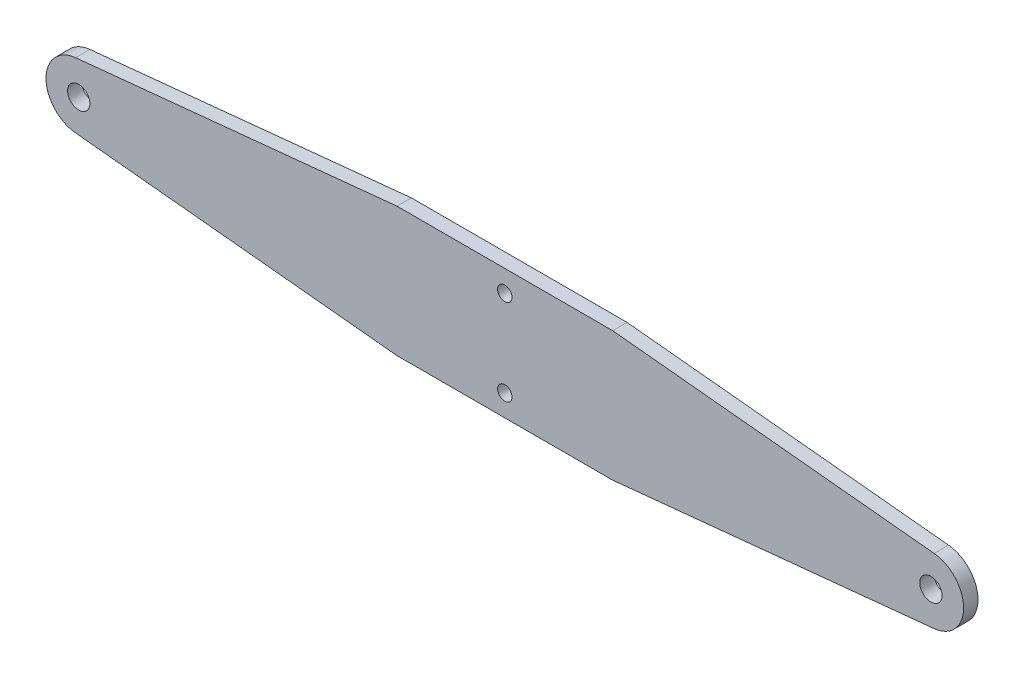
ISO-10303-21;
HEADER;
FILE_DESCRIPTION(('STEP AP214'),'2;1');
FILE_NAME('part.step','',(''),(''),'','','');
FILE_SCHEMA(('AUTOMOTIVE_DESIGN { 1 0 10303 214 1 1 1 1 }'));
ENDSEC;
DATA;
#1=APPLICATION_CONTEXT('core data for automotive mechanical design processes');
#2=APPLICATION_PROTOCOL_DEFINITION('international standard','automotive_design',2000,#1);
#3=PRODUCT_CONTEXT('',#1,'mechanical');
#4=PRODUCT('Part','Part','',(#3));
#5=PRODUCT_RELATED_PRODUCT_CATEGORY('part','',(#4));
#6=PRODUCT_DEFINITION_FORMATION('','',#4);
#7=PRODUCT_DEFINITION_CONTEXT('part definition',#1,'design');
#8=PRODUCT_DEFINITION('design','',#6,#7);
#9=PRODUCT_DEFINITION_SHAPE('','',#8);
#10=(LENGTH_UNIT() NAMED_UNIT(*) SI_UNIT(.MILLI.,.METRE.));
#11=(NAMED_UNIT(*) PLANE_ANGLE_UNIT() SI_UNIT($,.RADIAN.));
#12=(NAMED_UNIT(*) SI_UNIT($,.STERADIAN.) SOLID_ANGLE_UNIT());
#13=UNCERTAINTY_MEASURE_WITH_UNIT(LENGTH_MEASURE(1.E-05),#10,'distance_accuracy_value','');
#14=(GEOMETRIC_REPRESENTATION_CONTEXT(3) GLOBAL_UNCERTAINTY_ASSIGNED_CONTEXT((#13)) GLOBAL_UNIT_ASSIGNED_CONTEXT((#10,
#11,#12)) REPRESENTATION_CONTEXT('',''));
#15=CARTESIAN_POINT('',(0.,0.,0.));
#16=DIRECTION('',(0.,0.,1.));
#17=DIRECTION('',(1.,0.,0.));
#18=AXIS2_PLACEMENT_3D('',#15,#16,#17);
#19=CARTESIAN_POINT('',(-59.25,-3.57680115802996E-13,2.));
#20=DIRECTION('',(0.,0.,1.));
#21=DIRECTION('',(1.,0.,0.));
#22=AXIS2_PLACEMENT_3D('',#19,#20,#21);
#23=PLANE('',#22);
#24=CARTESIAN_POINT('',(59.25,-3.57680115025062E-13,2.));
#25=DIRECTION('',(0.,0.,1.));
#26=DIRECTION('',(1.,0.,0.));
#27=AXIS2_PLACEMENT_3D('',#24,#25,#26);
#28=CIRCLE('',#27,1.54999999999999);
#29=CARTESIAN_POINT('',(60.8,-3.57680115025062E-13,2.));
#30=VERTEX_POINT('',#29);
#31=EDGE_CURVE('E200',#30,#30,#28,.T.);
#32=ORIENTED_EDGE('',*,*,#31,.F.);
#33=EDGE_LOOP('',(#32));
#34=FACE_BOUND('',#33,.T.);
#35=CARTESIAN_POINT('',(0.,-6.,2.));
#36=DIRECTION('',(0.,0.,1.));
#37=DIRECTION('',(1.,0.,0.));
#38=AXIS2_PLACEMENT_3D('',#35,#36,#37);
#39=CIRCLE('',#38,0.999999999999999);
#40=CARTESIAN_POINT('',(0.999999999999999,-6.,2.));
#41=VERTEX_POINT('',#40);
#42=EDGE_CURVE('E146',#41,#41,#39,.T.);
#43=ORIENTED_EDGE('',*,*,#42,.F.);
#44=EDGE_LOOP('',(#43));
#45=FACE_BOUND('',#44,.T.);
#46=CARTESIAN_POINT('',(-59.25,-3.57680115802996E-13,2.));
#47=DIRECTION('',(0.,0.,1.));
#48=DIRECTION('',(1.,0.,0.));
#49=AXIS2_PLACEMENT_3D('',#46,#47,#48);
#50=CIRCLE('',#49,4.55000000000007);
#51=CARTESIAN_POINT('',(-59.7029732140596,4.52739608023655,2.));
#52=VERTEX_POINT('',#51);
#53=CARTESIAN_POINT('',(-59.7029732140607,-4.5273960802373,2.));
#54=VERTEX_POINT('',#53);
#55=EDGE_CURVE('E157',#52,#54,#50,.T.);
#56=ORIENTED_EDGE('',*,*,#55,.T.);
#57=DIRECTION('',(0.995032105546576,-0.0995545525405429,0.));
#58=VECTOR('',#57,1.);
#59=CARTESIAN_POINT('',(-59.7029732140607,-4.5273960802373,2.));
#60=LINE('',#59,#58);
#61=CARTESIAN_POINT('',(-15.,-9.00000000000034,2.));
#62=VERTEX_POINT('',#61);
#63=EDGE_CURVE('E105',#54,#62,#60,.T.);
#64=ORIENTED_EDGE('',*,*,#63,.T.);
#65=DIRECTION('',(1.,0.,0.));
#66=VECTOR('',#65,1.);
#67=CARTESIAN_POINT('',(15.,-9.00000000000034,2.));
#68=LINE('',#67,#66);
#69=CARTESIAN_POINT('',(15.,-9.00000000000034,2.));
#70=VERTEX_POINT('',#69);
#71=EDGE_CURVE('E172',#62,#70,#68,.T.);
#72=ORIENTED_EDGE('',*,*,#71,.T.);
#73=DIRECTION('',(0.995032105546576,0.0995545525405459,0.));
#74=VECTOR('',#73,1.);
#75=CARTESIAN_POINT('',(59.7029732140593,-4.5273960802373,2.));
#76=LINE('',#75,#74);
#77=CARTESIAN_POINT('',(59.7029732140593,-4.5273960802373,2.));
#78=VERTEX_POINT('',#77);
#79=EDGE_CURVE('E185',#70,#78,#76,.T.);
#80=ORIENTED_EDGE('',*,*,#79,.T.);
#81=CARTESIAN_POINT('',(59.25,-3.57680115025062E-13,2.));
#82=DIRECTION('',(0.,0.,1.));
#83=DIRECTION('',(1.,0.,0.));
#84=AXIS2_PLACEMENT_3D('',#81,#82,#83);
#85=CIRCLE('',#84,4.55000000000001);
#86=CARTESIAN_POINT('',(59.7029732140597,4.52739608023655,2.));
#87=VERTEX_POINT('',#86);
#88=EDGE_CURVE('E124',#78,#87,#85,.T.);
#89=ORIENTED_EDGE('',*,*,#88,.T.);
#90=DIRECTION('',(-0.995032105546575,0.0995545525405534,0.));
#91=VECTOR('',#90,1.);
#92=CARTESIAN_POINT('',(59.7029732140597,4.52739608023655,2.));
#93=LINE('',#92,#91);
#94=CARTESIAN_POINT('',(15.,8.99999999999997,2.));
#95=VERTEX_POINT('',#94);
#96=EDGE_CURVE('E118',#87,#95,#93,.T.);
#97=ORIENTED_EDGE('',*,*,#96,.T.);
#98=DIRECTION('',(-1.,0.,0.));
#99=VECTOR('',#98,1.);
#100=CARTESIAN_POINT('',(15.,8.99999999999997,2.));
#101=LINE('',#100,#99);
#102=CARTESIAN_POINT('',(-15.,8.99999999999997,2.));
#103=VERTEX_POINT('',#102);
#104=EDGE_CURVE('E122',#95,#103,#101,.T.);
#105=ORIENTED_EDGE('',*,*,#104,.T.);
#106=DIRECTION('',(-0.995032105546575,-0.0995545525405534,0.));
#107=VECTOR('',#106,1.);
#108=CARTESIAN_POINT('',(-59.7029732140596,4.52739608023655,2.));
#109=LINE('',#108,#107);
#110=EDGE_CURVE('E62',#103,#52,#109,.T.);
#111=ORIENTED_EDGE('',*,*,#110,.T.);
#112=EDGE_LOOP('',(#56,#64,#72,#80,#89,#97,#105,#111));
#113=FACE_BOUND('',#112,.T.);
#114=CARTESIAN_POINT('',(-59.25,-3.57680115802996E-13,2.));
#115=DIRECTION('',(0.,0.,1.));
#116=DIRECTION('',(1.,0.,0.));
#117=AXIS2_PLACEMENT_3D('',#114,#115,#116);
#118=CIRCLE('',#117,1.55);
#119=CARTESIAN_POINT('',(-57.7,-3.57680115802996E-13,2.));
#120=VERTEX_POINT('',#119);
#121=EDGE_CURVE('E194',#120,#120,#118,.T.);
#122=ORIENTED_EDGE('',*,*,#121,.F.);
#123=EDGE_LOOP('',(#122));
#124=FACE_BOUND('',#123,.T.);
#125=CARTESIAN_POINT('',(0.,6.,2.));
#126=DIRECTION('',(0.,0.,1.));
#127=DIRECTION('',(-1.,0.,0.));
#128=AXIS2_PLACEMENT_3D('',#125,#126,#127);
#129=CIRCLE('',#128,1.);
#130=CARTESIAN_POINT('',(-1.,6.,2.));
#131=VERTEX_POINT('',#130);
#132=EDGE_CURVE('E206',#131,#131,#129,.T.);
#133=ORIENTED_EDGE('',*,*,#132,.F.);
#134=EDGE_LOOP('',(#133));
#135=FACE_BOUND('',#134,.T.);
#136=ADVANCED_FACE('F45',(#34,#45,#113,#124,#135),#23,.T.);
#137=CARTESIAN_POINT('',(-59.25,-3.57680115802996E-13,0.));
#138=DIRECTION('',(0.,0.,1.));
#139=DIRECTION('',(1.,0.,0.));
#140=AXIS2_PLACEMENT_3D('',#137,#138,#139);
#141=PLANE('',#140);
#142=CARTESIAN_POINT('',(-59.25,-3.57680115802996E-13,0.));
#143=DIRECTION('',(0.,0.,1.));
#144=DIRECTION('',(1.,0.,0.));
#145=AXIS2_PLACEMENT_3D('',#142,#143,#144);
#146=CIRCLE('',#145,4.55000000000007);
#147=CARTESIAN_POINT('',(-59.7029732140596,4.52739608023655,0.));
#148=VERTEX_POINT('',#147);
#149=CARTESIAN_POINT('',(-59.7029732140607,-4.5273960802373,0.));
#150=VERTEX_POINT('',#149);
#151=EDGE_CURVE('E142',#148,#150,#146,.T.);
#152=ORIENTED_EDGE('',*,*,#151,.F.);
#153=DIRECTION('',(-0.995032105546575,-0.0995545525405534,0.));
#154=VECTOR('',#153,1.);
#155=CARTESIAN_POINT('',(-59.7029732140596,4.52739608023655,0.));
#156=LINE('',#155,#154);
#157=CARTESIAN_POINT('',(-15.,8.99999999999997,0.));
#158=VERTEX_POINT('',#157);
#159=EDGE_CURVE('E97',#158,#148,#156,.T.);
#160=ORIENTED_EDGE('',*,*,#159,.F.);
#161=DIRECTION('',(-1.,0.,0.));
#162=VECTOR('',#161,1.);
#163=CARTESIAN_POINT('',(15.,8.99999999999997,0.));
#164=LINE('',#163,#162);
#165=CARTESIAN_POINT('',(15.,8.99999999999997,0.));
#166=VERTEX_POINT('',#165);
#167=EDGE_CURVE('E91',#166,#158,#164,.T.);
#168=ORIENTED_EDGE('',*,*,#167,.F.);
#169=DIRECTION('',(-0.995032105546575,0.0995545525405534,0.));
#170=VECTOR('',#169,1.);
#171=CARTESIAN_POINT('',(59.7029732140597,4.52739608023655,0.));
#172=LINE('',#171,#170);
#173=CARTESIAN_POINT('',(59.7029732140597,4.52739608023655,0.));
#174=VERTEX_POINT('',#173);
#175=EDGE_CURVE('E132',#174,#166,#172,.T.);
#176=ORIENTED_EDGE('',*,*,#175,.F.);
#177=CARTESIAN_POINT('',(59.25,-3.57680115025062E-13,0.));
#178=DIRECTION('',(0.,0.,1.));
#179=DIRECTION('',(1.,0.,0.));
#180=AXIS2_PLACEMENT_3D('',#177,#178,#179);
#181=CIRCLE('',#180,4.55000000000001);
#182=CARTESIAN_POINT('',(59.7029732140593,-4.5273960802373,0.));
#183=VERTEX_POINT('',#182);
#184=EDGE_CURVE('E152',#183,#174,#181,.T.);
#185=ORIENTED_EDGE('',*,*,#184,.F.);
#186=DIRECTION('',(0.995032105546576,0.0995545525405459,0.));
#187=VECTOR('',#186,1.);
#188=CARTESIAN_POINT('',(59.7029732140593,-4.5273960802373,0.));
#189=LINE('',#188,#187);
#190=CARTESIAN_POINT('',(15.,-9.00000000000034,0.));
#191=VERTEX_POINT('',#190);
#192=EDGE_CURVE('E150',#191,#183,#189,.T.);
#193=ORIENTED_EDGE('',*,*,#192,.F.);
#194=DIRECTION('',(1.,0.,0.));
#195=VECTOR('',#194,1.);
#196=CARTESIAN_POINT('',(15.,-9.00000000000034,0.));
#197=LINE('',#196,#195);
#198=CARTESIAN_POINT('',(-15.,-9.00000000000034,0.));
#199=VERTEX_POINT('',#198);
#200=EDGE_CURVE('E148',#199,#191,#197,.T.);
#201=ORIENTED_EDGE('',*,*,#200,.F.);
#202=DIRECTION('',(0.995032105546576,-0.0995545525405429,0.));
#203=VECTOR('',#202,1.);
#204=CARTESIAN_POINT('',(-59.7029732140607,-4.5273960802373,0.));
#205=LINE('',#204,#203);
#206=EDGE_CURVE('E145',#150,#199,#205,.T.);
#207=ORIENTED_EDGE('',*,*,#206,.F.);
#208=EDGE_LOOP('',(#152,#160,#168,#176,#185,#193,#201,#207));
#209=FACE_BOUND('',#208,.T.);
#210=CARTESIAN_POINT('',(0.,-6.,0.));
#211=DIRECTION('',(0.,0.,1.));
#212=DIRECTION('',(1.,0.,0.));
#213=AXIS2_PLACEMENT_3D('',#210,#211,#212);
#214=CIRCLE('',#213,0.999999999999999);
#215=CARTESIAN_POINT('',(0.999999999999999,-6.,0.));
#216=VERTEX_POINT('',#215);
#217=EDGE_CURVE('E191',#216,#216,#214,.T.);
#218=ORIENTED_EDGE('',*,*,#217,.T.);
#219=EDGE_LOOP('',(#218));
#220=FACE_BOUND('',#219,.T.);
#221=CARTESIAN_POINT('',(-59.25,-3.57680115802996E-13,0.));
#222=DIRECTION('',(0.,0.,1.));
#223=DIRECTION('',(1.,0.,0.));
#224=AXIS2_PLACEMENT_3D('',#221,#222,#223);
#225=CIRCLE('',#224,1.55);
#226=CARTESIAN_POINT('',(-57.7,-3.57680115802996E-13,0.));
#227=VERTEX_POINT('',#226);
#228=EDGE_CURVE('E197',#227,#227,#225,.T.);
#229=ORIENTED_EDGE('',*,*,#228,.T.);
#230=EDGE_LOOP('',(#229));
#231=FACE_BOUND('',#230,.T.);
#232=CARTESIAN_POINT('',(59.25,-3.57680115025062E-13,0.));
#233=DIRECTION('',(0.,0.,1.));
#234=DIRECTION('',(1.,0.,0.));
#235=AXIS2_PLACEMENT_3D('',#232,#233,#234);
#236=CIRCLE('',#235,1.54999999999999);
#237=CARTESIAN_POINT('',(60.8,-3.57680115025062E-13,0.));
#238=VERTEX_POINT('',#237);
#239=EDGE_CURVE('E203',#238,#238,#236,.T.);
#240=ORIENTED_EDGE('',*,*,#239,.T.);
#241=EDGE_LOOP('',(#240));
#242=FACE_BOUND('',#241,.T.);
#243=CARTESIAN_POINT('',(0.,6.,0.));
#244=DIRECTION('',(0.,0.,1.));
#245=DIRECTION('',(-1.,0.,0.));
#246=AXIS2_PLACEMENT_3D('',#243,#244,#245);
#247=CIRCLE('',#246,1.);
#248=CARTESIAN_POINT('',(-1.,6.,0.));
#249=VERTEX_POINT('',#248);
#250=EDGE_CURVE('E209',#249,#249,#247,.T.);
#251=ORIENTED_EDGE('',*,*,#250,.T.);
#252=EDGE_LOOP('',(#251));
#253=FACE_BOUND('',#252,.T.);
#254=ADVANCED_FACE('F176',(#209,#220,#231,#242,#253),#141,.F.);
#255=CARTESIAN_POINT('',(-59.25,-3.57680115802996E-13,2.));
#256=DIRECTION('',(0.,0.,-1.));
#257=DIRECTION('',(-1.,0.,0.));
#258=AXIS2_PLACEMENT_3D('',#255,#256,#257);
#259=CYLINDRICAL_SURFACE('',#258,4.55000000000007);
#260=ORIENTED_EDGE('',*,*,#151,.T.);
#261=DIRECTION('',(0.,0.,-1.));
#262=VECTOR('',#261,1.);
#263=CARTESIAN_POINT('',(-59.7029732140607,-4.5273960802373,2.));
#264=LINE('',#263,#262);
#265=EDGE_CURVE('E11',#54,#150,#264,.T.);
#266=ORIENTED_EDGE('',*,*,#265,.F.);
#267=ORIENTED_EDGE('',*,*,#55,.F.);
#268=DIRECTION('',(0.,0.,-1.));
#269=VECTOR('',#268,1.);
#270=CARTESIAN_POINT('',(-59.7029732140596,4.52739608023655,2.));
#271=LINE('',#270,#269);
#272=EDGE_CURVE('E138',#52,#148,#271,.T.);
#273=ORIENTED_EDGE('',*,*,#272,.T.);
#274=EDGE_LOOP('',(#260,#266,#267,#273));
#275=FACE_BOUND('',#274,.T.);
#276=ADVANCED_FACE('F47',(#275),#259,.T.);
#277=CARTESIAN_POINT('',(-59.7029732140607,-4.5273960802373,2.));
#278=DIRECTION('',(0.0995545525405429,0.995032105546576,0.));
#279=DIRECTION('',(-0.995032105546576,0.0995545525405429,0.));
#280=AXIS2_PLACEMENT_3D('',#277,#278,#279);
#281=PLANE('',#280);
#282=ORIENTED_EDGE('',*,*,#206,.T.);
#283=DIRECTION('',(0.,0.,-1.));
#284=VECTOR('',#283,1.);
#285=CARTESIAN_POINT('',(-15.,-9.00000000000034,2.));
#286=LINE('',#285,#284);
#287=EDGE_CURVE('E54',#62,#199,#286,.T.);
#288=ORIENTED_EDGE('',*,*,#287,.F.);
#289=ORIENTED_EDGE('',*,*,#63,.F.);
#290=ORIENTED_EDGE('',*,*,#265,.T.);
#291=EDGE_LOOP('',(#282,#288,#289,#290));
#292=FACE_BOUND('',#291,.T.);
#293=ADVANCED_FACE('F243',(#292),#281,.F.);
#294=CARTESIAN_POINT('',(15.,-9.00000000000034,2.));
#295=DIRECTION('',(0.,1.,0.));
#296=DIRECTION('',(0.,0.,1.));
#297=AXIS2_PLACEMENT_3D('',#294,#295,#296);
#298=PLANE('',#297);
#299=ORIENTED_EDGE('',*,*,#200,.T.);
#300=DIRECTION('',(0.,0.,-1.));
#301=VECTOR('',#300,1.);
#302=CARTESIAN_POINT('',(15.,-9.00000000000034,2.));
#303=LINE('',#302,#301);
#304=EDGE_CURVE('E164',#70,#191,#303,.T.);
#305=ORIENTED_EDGE('',*,*,#304,.F.);
#306=ORIENTED_EDGE('',*,*,#71,.F.);
#307=ORIENTED_EDGE('',*,*,#287,.T.);
#308=EDGE_LOOP('',(#299,#305,#306,#307));
#309=FACE_BOUND('',#308,.T.);
#310=ADVANCED_FACE('F170',(#309),#298,.F.);
#311=CARTESIAN_POINT('',(59.7029732140593,-4.5273960802373,2.));
#312=DIRECTION('',(-0.0995545525405459,0.995032105546576,0.));
#313=DIRECTION('',(-0.995032105546576,-0.0995545525405459,0.));
#314=AXIS2_PLACEMENT_3D('',#311,#312,#313);
#315=PLANE('',#314);
#316=ORIENTED_EDGE('',*,*,#192,.T.);
#317=DIRECTION('',(0.,0.,-1.));
#318=VECTOR('',#317,1.);
#319=CARTESIAN_POINT('',(59.7029732140593,-4.5273960802373,2.));
#320=LINE('',#319,#318);
#321=EDGE_CURVE('E161',#78,#183,#320,.T.);
#322=ORIENTED_EDGE('',*,*,#321,.F.);
#323=ORIENTED_EDGE('',*,*,#79,.F.);
#324=ORIENTED_EDGE('',*,*,#304,.T.);
#325=EDGE_LOOP('',(#316,#322,#323,#324));
#326=FACE_BOUND('',#325,.T.);
#327=ADVANCED_FACE('F181',(#326),#315,.F.);
#328=CARTESIAN_POINT('',(59.25,-3.57680115025062E-13,2.));
#329=DIRECTION('',(0.,0.,-1.));
#330=DIRECTION('',(-1.,0.,0.));
#331=AXIS2_PLACEMENT_3D('',#328,#329,#330);
#332=CYLINDRICAL_SURFACE('',#331,4.55000000000001);
#333=ORIENTED_EDGE('',*,*,#184,.T.);
#334=DIRECTION('',(0.,0.,-1.));
#335=VECTOR('',#334,1.);
#336=CARTESIAN_POINT('',(59.7029732140597,4.52739608023655,2.));
#337=LINE('',#336,#335);
#338=EDGE_CURVE('E133',#87,#174,#337,.T.);
#339=ORIENTED_EDGE('',*,*,#338,.F.);
#340=ORIENTED_EDGE('',*,*,#88,.F.);
#341=ORIENTED_EDGE('',*,*,#321,.T.);
#342=EDGE_LOOP('',(#333,#339,#340,#341));
#343=FACE_BOUND('',#342,.T.);
#344=ADVANCED_FACE('F184',(#343),#332,.T.);
#345=CARTESIAN_POINT('',(59.7029732140597,4.52739608023655,2.));
#346=DIRECTION('',(-0.0995545525405534,-0.995032105546575,0.));
#347=DIRECTION('',(0.995032105546575,-0.0995545525405535,0.));
#348=AXIS2_PLACEMENT_3D('',#345,#346,#347);
#349=PLANE('',#348);
#350=ORIENTED_EDGE('',*,*,#175,.T.);
#351=DIRECTION('',(0.,0.,-1.));
#352=VECTOR('',#351,1.);
#353=CARTESIAN_POINT('',(15.,8.99999999999997,2.));
#354=LINE('',#353,#352);
#355=EDGE_CURVE('E129',#95,#166,#354,.T.);
#356=ORIENTED_EDGE('',*,*,#355,.F.);
#357=ORIENTED_EDGE('',*,*,#96,.F.);
#358=ORIENTED_EDGE('',*,*,#338,.T.);
#359=EDGE_LOOP('',(#350,#356,#357,#358));
#360=FACE_BOUND('',#359,.T.);
#361=ADVANCED_FACE('F130',(#360),#349,.F.);
#362=CARTESIAN_POINT('',(15.,8.99999999999997,2.));
#363=DIRECTION('',(0.,-1.,0.));
#364=DIRECTION('',(0.,0.,-1.));
#365=AXIS2_PLACEMENT_3D('',#362,#363,#364);
#366=PLANE('',#365);
#367=ORIENTED_EDGE('',*,*,#167,.T.);
#368=DIRECTION('',(0.,0.,-1.));
#369=VECTOR('',#368,1.);
#370=CARTESIAN_POINT('',(-15.,8.99999999999997,2.));
#371=LINE('',#370,#369);
#372=EDGE_CURVE('E134',#103,#158,#371,.T.);
#373=ORIENTED_EDGE('',*,*,#372,.F.);
#374=ORIENTED_EDGE('',*,*,#104,.F.);
#375=ORIENTED_EDGE('',*,*,#355,.T.);
#376=EDGE_LOOP('',(#367,#373,#374,#375));
#377=FACE_BOUND('',#376,.T.);
#378=ADVANCED_FACE('F136',(#377),#366,.F.);
#379=CARTESIAN_POINT('',(-59.7029732140596,4.52739608023655,2.));
#380=DIRECTION('',(0.0995545525405534,-0.995032105546575,0.));
#381=DIRECTION('',(0.995032105546575,0.0995545525405534,0.));
#382=AXIS2_PLACEMENT_3D('',#379,#380,#381);
#383=PLANE('',#382);
#384=ORIENTED_EDGE('',*,*,#159,.T.);
#385=ORIENTED_EDGE('',*,*,#272,.F.);
#386=ORIENTED_EDGE('',*,*,#110,.F.);
#387=ORIENTED_EDGE('',*,*,#372,.T.);
#388=EDGE_LOOP('',(#384,#385,#386,#387));
#389=FACE_BOUND('',#388,.T.);
#390=ADVANCED_FACE('F231',(#389),#383,.F.);
#391=CARTESIAN_POINT('',(0.,-6.,2.));
#392=DIRECTION('',(0.,0.,-1.));
#393=DIRECTION('',(-1.,0.,0.));
#394=AXIS2_PLACEMENT_3D('',#391,#392,#393);
#395=CYLINDRICAL_SURFACE('',#394,0.999999999999999);
#396=ORIENTED_EDGE('',*,*,#42,.T.);
#397=EDGE_LOOP('',(#396));
#398=FACE_BOUND('',#397,.T.);
#399=ORIENTED_EDGE('',*,*,#217,.F.);
#400=EDGE_LOOP('',(#399));
#401=FACE_BOUND('',#400,.T.);
#402=ADVANCED_FACE('F228',(#398,#401),#395,.F.);
#403=CARTESIAN_POINT('',(-59.25,-3.57680115802996E-13,2.));
#404=DIRECTION('',(0.,0.,-1.));
#405=DIRECTION('',(-1.,0.,0.));
#406=AXIS2_PLACEMENT_3D('',#403,#404,#405);
#407=CYLINDRICAL_SURFACE('',#406,1.55);
#408=ORIENTED_EDGE('',*,*,#121,.T.);
#409=EDGE_LOOP('',(#408));
#410=FACE_BOUND('',#409,.T.);
#411=ORIENTED_EDGE('',*,*,#228,.F.);
#412=EDGE_LOOP('',(#411));
#413=FACE_BOUND('',#412,.T.);
#414=ADVANCED_FACE('F308',(#410,#413),#407,.F.);
#415=CARTESIAN_POINT('',(59.25,-3.57680115025062E-13,2.));
#416=DIRECTION('',(0.,0.,-1.));
#417=DIRECTION('',(-1.,0.,0.));
#418=AXIS2_PLACEMENT_3D('',#415,#416,#417);
#419=CYLINDRICAL_SURFACE('',#418,1.54999999999999);
#420=ORIENTED_EDGE('',*,*,#31,.T.);
#421=EDGE_LOOP('',(#420));
#422=FACE_BOUND('',#421,.T.);
#423=ORIENTED_EDGE('',*,*,#239,.F.);
#424=EDGE_LOOP('',(#423));
#425=FACE_BOUND('',#424,.T.);
#426=ADVANCED_FACE('F316',(#422,#425),#419,.F.);
#427=CARTESIAN_POINT('',(0.,6.,2.));
#428=DIRECTION('',(0.,0.,-1.));
#429=DIRECTION('',(-1.,0.,0.));
#430=AXIS2_PLACEMENT_3D('',#427,#428,#429);
#431=CYLINDRICAL_SURFACE('',#430,1.);
#432=ORIENTED_EDGE('',*,*,#132,.T.);
#433=EDGE_LOOP('',(#432));
#434=FACE_BOUND('',#433,.T.);
#435=ORIENTED_EDGE('',*,*,#250,.F.);
#436=EDGE_LOOP('',(#435));
#437=FACE_BOUND('',#436,.T.);
#438=ADVANCED_FACE('F215',(#434,#437),#431,.F.);
#439=CLOSED_SHELL('',(#136,#254,#276,#293,#310,#327,#344,#361,#378,#390,#402,#414,#426,#438));
#440=MANIFOLD_SOLID_BREP('B2',#439);
#441=ADVANCED_BREP_SHAPE_REPRESENTATION('',(#18,#440),#14);
#442=SHAPE_DEFINITION_REPRESENTATION(#9,#441);
ENDSEC;
END-ISO-10303-21;
